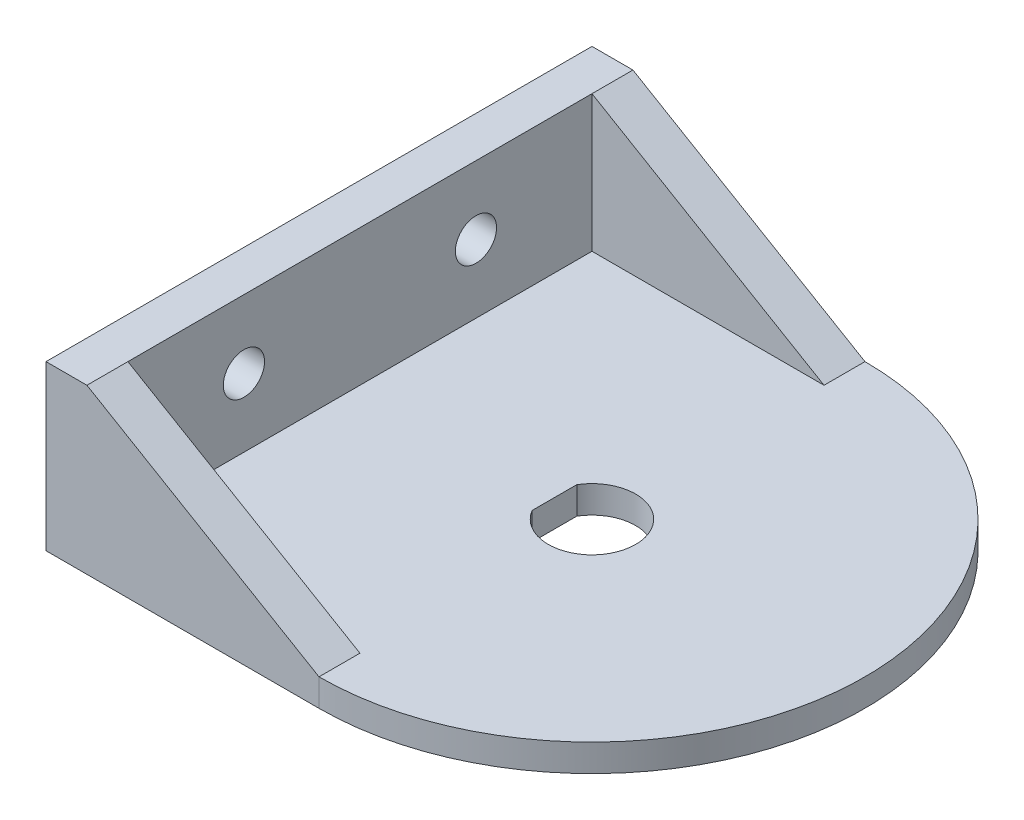
ISO-10303-21;
HEADER;
FILE_DESCRIPTION(('STEP AP214'),'2;1');
FILE_NAME('part.step','',(''),(''),'','','');
FILE_SCHEMA(('AUTOMOTIVE_DESIGN { 1 0 10303 214 1 1 1 1 }'));
ENDSEC;
DATA;
#1=APPLICATION_CONTEXT('core data for automotive mechanical design processes');
#2=APPLICATION_PROTOCOL_DEFINITION('international standard','automotive_design',2000,#1);
#3=PRODUCT_CONTEXT('',#1,'mechanical');
#4=PRODUCT('Part','Part','',(#3));
#5=PRODUCT_RELATED_PRODUCT_CATEGORY('part','',(#4));
#6=PRODUCT_DEFINITION_FORMATION('','',#4);
#7=PRODUCT_DEFINITION_CONTEXT('part definition',#1,'design');
#8=PRODUCT_DEFINITION('design','',#6,#7);
#9=PRODUCT_DEFINITION_SHAPE('','',#8);
#10=(LENGTH_UNIT() NAMED_UNIT(*) SI_UNIT(.MILLI.,.METRE.));
#11=(NAMED_UNIT(*) PLANE_ANGLE_UNIT() SI_UNIT($,.RADIAN.));
#12=(NAMED_UNIT(*) SI_UNIT($,.STERADIAN.) SOLID_ANGLE_UNIT());
#13=UNCERTAINTY_MEASURE_WITH_UNIT(LENGTH_MEASURE(1.E-05),#10,'distance_accuracy_value','');
#14=(GEOMETRIC_REPRESENTATION_CONTEXT(3) GLOBAL_UNCERTAINTY_ASSIGNED_CONTEXT((#13)) GLOBAL_UNIT_ASSIGNED_CONTEXT((#10,
#11,#12)) REPRESENTATION_CONTEXT('',''));
#15=CARTESIAN_POINT('',(0.,0.,0.));
#16=DIRECTION('',(0.,0.,1.));
#17=DIRECTION('',(1.,0.,0.));
#18=AXIS2_PLACEMENT_3D('',#15,#16,#17);
#19=CARTESIAN_POINT('',(0.,2.,0.));
#20=DIRECTION('',(0.,-1.,0.));
#21=DIRECTION('',(0.,0.,-1.));
#22=AXIS2_PLACEMENT_3D('',#19,#20,#21);
#23=CYLINDRICAL_SURFACE('',#22,3.2);
#24=CARTESIAN_POINT('',(0.,2.,0.));
#25=DIRECTION('',(0.,1.,0.));
#26=DIRECTION('',(0.,0.,1.));
#27=AXIS2_PLACEMENT_3D('',#24,#25,#26);
#28=CIRCLE('',#27,3.2);
#29=CARTESIAN_POINT('',(-2.75,2.,1.63630681719536));
#30=VERTEX_POINT('',#29);
#31=CARTESIAN_POINT('',(-2.75,2.,-1.63630681719536));
#32=VERTEX_POINT('',#31);
#33=EDGE_CURVE('E135',#30,#32,#28,.T.);
#34=ORIENTED_EDGE('',*,*,#33,.T.);
#35=DIRECTION('',(0.,1.,0.));
#36=VECTOR('',#35,1.);
#37=CARTESIAN_POINT('',(-2.75,-3.30340733183179,-1.63630681719536));
#38=LINE('',#37,#36);
#39=CARTESIAN_POINT('',(-2.75,0.,-1.63630681719536));
#40=VERTEX_POINT('',#39);
#41=EDGE_CURVE('E121',#40,#32,#38,.T.);
#42=ORIENTED_EDGE('',*,*,#41,.F.);
#43=CARTESIAN_POINT('',(0.,0.,0.));
#44=DIRECTION('',(0.,1.,0.));
#45=DIRECTION('',(0.,0.,1.));
#46=AXIS2_PLACEMENT_3D('',#43,#44,#45);
#47=CIRCLE('',#46,3.2);
#48=CARTESIAN_POINT('',(-2.75,0.,1.63630681719536));
#49=VERTEX_POINT('',#48);
#50=EDGE_CURVE('E148',#49,#40,#47,.T.);
#51=ORIENTED_EDGE('',*,*,#50,.F.);
#52=DIRECTION('',(0.,1.,0.));
#53=VECTOR('',#52,1.);
#54=CARTESIAN_POINT('',(-2.75,-3.30340733183179,1.63630681719536));
#55=LINE('',#54,#53);
#56=EDGE_CURVE('E61',#49,#30,#55,.T.);
#57=ORIENTED_EDGE('',*,*,#56,.T.);
#58=EDGE_LOOP('',(#34,#42,#51,#57));
#59=FACE_BOUND('',#58,.T.);
#60=ADVANCED_FACE('F45',(#59),#23,.F.);
#61=CARTESIAN_POINT('',(-17.,12.,0.));
#62=DIRECTION('',(1.,0.,0.));
#63=DIRECTION('',(0.,0.,-1.));
#64=AXIS2_PLACEMENT_3D('',#61,#62,#63);
#65=PLANE('',#64);
#66=CARTESIAN_POINT('',(-17.,7.,8.5));
#67=DIRECTION('',(1.,0.,0.));
#68=DIRECTION('',(0.,0.,-1.));
#69=AXIS2_PLACEMENT_3D('',#66,#67,#68);
#70=CIRCLE('',#69,1.51);
#71=CARTESIAN_POINT('',(-17.,7.,6.99));
#72=VERTEX_POINT('',#71);
#73=EDGE_CURVE('E518',#72,#72,#70,.T.);
#74=ORIENTED_EDGE('',*,*,#73,.F.);
#75=EDGE_LOOP('',(#74));
#76=FACE_BOUND('',#75,.T.);
#77=CARTESIAN_POINT('',(-17.,7.,-8.5));
#78=DIRECTION('',(1.,0.,0.));
#79=DIRECTION('',(0.,0.,-1.));
#80=AXIS2_PLACEMENT_3D('',#77,#78,#79);
#81=CIRCLE('',#80,1.51);
#82=CARTESIAN_POINT('',(-17.,7.,-10.01));
#83=VERTEX_POINT('',#82);
#84=EDGE_CURVE('E526',#83,#83,#81,.T.);
#85=ORIENTED_EDGE('',*,*,#84,.F.);
#86=EDGE_LOOP('',(#85));
#87=FACE_BOUND('',#86,.T.);
#88=DIRECTION('',(0.,1.,0.));
#89=VECTOR('',#88,1.);
#90=CARTESIAN_POINT('',(-17.,2.,-17.));
#91=LINE('',#90,#89);
#92=CARTESIAN_POINT('',(-17.,2.,-17.));
#93=VERTEX_POINT('',#92);
#94=CARTESIAN_POINT('',(-17.,12.,-17.));
#95=VERTEX_POINT('',#94);
#96=EDGE_CURVE('E240',#93,#95,#91,.T.);
#97=ORIENTED_EDGE('',*,*,#96,.T.);
#98=DIRECTION('',(0.,0.,1.));
#99=VECTOR('',#98,1.);
#100=CARTESIAN_POINT('',(-17.,12.,0.));
#101=LINE('',#100,#99);
#102=CARTESIAN_POINT('',(-17.,12.,17.));
#103=VERTEX_POINT('',#102);
#104=EDGE_CURVE('E226',#95,#103,#101,.T.);
#105=ORIENTED_EDGE('',*,*,#104,.T.);
#106=DIRECTION('',(0.,-1.,0.));
#107=VECTOR('',#106,1.);
#108=CARTESIAN_POINT('',(-17.,2.,17.));
#109=LINE('',#108,#107);
#110=CARTESIAN_POINT('',(-17.,2.,17.));
#111=VERTEX_POINT('',#110);
#112=EDGE_CURVE('E205',#103,#111,#109,.T.);
#113=ORIENTED_EDGE('',*,*,#112,.T.);
#114=DIRECTION('',(0.,0.,-1.));
#115=VECTOR('',#114,1.);
#116=CARTESIAN_POINT('',(-17.,2.,0.));
#117=LINE('',#116,#115);
#118=EDGE_CURVE('E157',#111,#93,#117,.T.);
#119=ORIENTED_EDGE('',*,*,#118,.T.);
#120=EDGE_LOOP('',(#97,#105,#113,#119));
#121=FACE_BOUND('',#120,.T.);
#122=ADVANCED_FACE('F239',(#76,#87,#121),#65,.T.);
#123=CARTESIAN_POINT('',(0.,2.,0.));
#124=DIRECTION('',(0.,-1.,0.));
#125=DIRECTION('',(0.,0.,-1.));
#126=AXIS2_PLACEMENT_3D('',#123,#124,#125);
#127=CYLINDRICAL_SURFACE('',#126,20.);
#128=CARTESIAN_POINT('',(0.,0.,0.));
#129=DIRECTION('',(0.,1.,0.));
#130=DIRECTION('',(0.,0.,1.));
#131=AXIS2_PLACEMENT_3D('',#128,#129,#130);
#132=CIRCLE('',#131,20.);
#133=CARTESIAN_POINT('',(0.,0.,20.));
#134=VERTEX_POINT('',#133);
#135=CARTESIAN_POINT('',(0.,0.,-20.));
#136=VERTEX_POINT('',#135);
#137=EDGE_CURVE('E152',#134,#136,#132,.T.);
#138=ORIENTED_EDGE('',*,*,#137,.T.);
#139=DIRECTION('',(0.,-1.,0.));
#140=VECTOR('',#139,1.);
#141=CARTESIAN_POINT('',(0.,2.,-20.));
#142=LINE('',#141,#140);
#143=CARTESIAN_POINT('',(0.,2.,-20.));
#144=VERTEX_POINT('',#143);
#145=EDGE_CURVE('E11',#144,#136,#142,.T.);
#146=ORIENTED_EDGE('',*,*,#145,.F.);
#147=CARTESIAN_POINT('',(0.,2.,0.));
#148=DIRECTION('',(0.,1.,0.));
#149=DIRECTION('',(0.,0.,1.));
#150=AXIS2_PLACEMENT_3D('',#147,#148,#149);
#151=CIRCLE('',#150,20.);
#152=CARTESIAN_POINT('',(0.,2.,20.));
#153=VERTEX_POINT('',#152);
#154=EDGE_CURVE('E141',#153,#144,#151,.T.);
#155=ORIENTED_EDGE('',*,*,#154,.F.);
#156=DIRECTION('',(0.,-1.,0.));
#157=VECTOR('',#156,1.);
#158=CARTESIAN_POINT('',(0.,2.,20.));
#159=LINE('',#158,#157);
#160=EDGE_CURVE('E140',#153,#134,#159,.T.);
#161=ORIENTED_EDGE('',*,*,#160,.T.);
#162=EDGE_LOOP('',(#138,#146,#155,#161));
#163=FACE_BOUND('',#162,.T.);
#164=ADVANCED_FACE('F47',(#163),#127,.T.);
#165=CARTESIAN_POINT('',(0.,2.,-20.));
#166=DIRECTION('',(0.,0.,1.));
#167=DIRECTION('',(1.,0.,0.));
#168=AXIS2_PLACEMENT_3D('',#165,#166,#167);
#169=PLANE('',#168);
#170=DIRECTION('',(-1.,0.,0.));
#171=VECTOR('',#170,1.);
#172=CARTESIAN_POINT('',(0.,0.,-20.));
#173=LINE('',#172,#171);
#174=CARTESIAN_POINT('',(-20.,0.,-20.));
#175=VERTEX_POINT('',#174);
#176=EDGE_CURVE('E156',#136,#175,#173,.T.);
#177=ORIENTED_EDGE('',*,*,#176,.T.);
#178=DIRECTION('',(0.,-1.,0.));
#179=VECTOR('',#178,1.);
#180=CARTESIAN_POINT('',(-20.,2.,-20.));
#181=LINE('',#180,#179);
#182=CARTESIAN_POINT('',(-20.,12.,-20.));
#183=VERTEX_POINT('',#182);
#184=EDGE_CURVE('E54',#183,#175,#181,.T.);
#185=ORIENTED_EDGE('',*,*,#184,.F.);
#186=DIRECTION('',(-1.,0.,0.));
#187=VECTOR('',#186,1.);
#188=CARTESIAN_POINT('',(0.,12.,-20.));
#189=LINE('',#188,#187);
#190=CARTESIAN_POINT('',(-17.,12.,-20.));
#191=VERTEX_POINT('',#190);
#192=EDGE_CURVE('E231',#191,#183,#189,.T.);
#193=ORIENTED_EDGE('',*,*,#192,.F.);
#194=DIRECTION('',(0.86193421515777,-0.507020126563394,0.));
#195=VECTOR('',#194,1.);
#196=CARTESIAN_POINT('',(-17.,12.,-20.));
#197=LINE('',#196,#195);
#198=EDGE_CURVE('E249',#191,#144,#197,.T.);
#199=ORIENTED_EDGE('',*,*,#198,.T.);
#200=ORIENTED_EDGE('',*,*,#145,.T.);
#201=EDGE_LOOP('',(#177,#185,#193,#199,#200));
#202=FACE_BOUND('',#201,.T.);
#203=ADVANCED_FACE('F287',(#202),#169,.F.);
#204=CARTESIAN_POINT('',(-20.,2.,0.));
#205=DIRECTION('',(1.,0.,0.));
#206=DIRECTION('',(0.,0.,-1.));
#207=AXIS2_PLACEMENT_3D('',#204,#205,#206);
#208=PLANE('',#207);
#209=CARTESIAN_POINT('',(-20.,7.,8.5));
#210=DIRECTION('',(1.,0.,0.));
#211=DIRECTION('',(0.,0.,-1.));
#212=AXIS2_PLACEMENT_3D('',#209,#210,#211);
#213=CIRCLE('',#212,1.51);
#214=CARTESIAN_POINT('',(-20.,7.,6.99));
#215=VERTEX_POINT('',#214);
#216=EDGE_CURVE('E137',#215,#215,#213,.T.);
#217=ORIENTED_EDGE('',*,*,#216,.T.);
#218=EDGE_LOOP('',(#217));
#219=FACE_BOUND('',#218,.T.);
#220=CARTESIAN_POINT('',(-20.,7.,-8.5));
#221=DIRECTION('',(1.,0.,0.));
#222=DIRECTION('',(0.,0.,-1.));
#223=AXIS2_PLACEMENT_3D('',#220,#221,#222);
#224=CIRCLE('',#223,1.51);
#225=CARTESIAN_POINT('',(-20.,7.,-10.01));
#226=VERTEX_POINT('',#225);
#227=EDGE_CURVE('E520',#226,#226,#224,.T.);
#228=ORIENTED_EDGE('',*,*,#227,.T.);
#229=EDGE_LOOP('',(#228));
#230=FACE_BOUND('',#229,.T.);
#231=DIRECTION('',(0.,0.,1.));
#232=VECTOR('',#231,1.);
#233=CARTESIAN_POINT('',(-20.,0.,0.));
#234=LINE('',#233,#232);
#235=CARTESIAN_POINT('',(-20.,0.,20.));
#236=VERTEX_POINT('',#235);
#237=EDGE_CURVE('E160',#175,#236,#234,.T.);
#238=ORIENTED_EDGE('',*,*,#237,.T.);
#239=DIRECTION('',(0.,-1.,0.));
#240=VECTOR('',#239,1.);
#241=CARTESIAN_POINT('',(-20.,2.,20.));
#242=LINE('',#241,#240);
#243=CARTESIAN_POINT('',(-20.,12.,20.));
#244=VERTEX_POINT('',#243);
#245=EDGE_CURVE('E146',#244,#236,#242,.T.);
#246=ORIENTED_EDGE('',*,*,#245,.F.);
#247=DIRECTION('',(0.,0.,1.));
#248=VECTOR('',#247,1.);
#249=CARTESIAN_POINT('',(-20.,12.,0.));
#250=LINE('',#249,#248);
#251=EDGE_CURVE('E177',#183,#244,#250,.T.);
#252=ORIENTED_EDGE('',*,*,#251,.F.);
#253=ORIENTED_EDGE('',*,*,#184,.T.);
#254=EDGE_LOOP('',(#238,#246,#252,#253));
#255=FACE_BOUND('',#254,.T.);
#256=ADVANCED_FACE('F175',(#219,#230,#255),#208,.F.);
#257=CARTESIAN_POINT('',(0.,2.,20.));
#258=DIRECTION('',(0.,0.,-1.));
#259=DIRECTION('',(-1.,0.,0.));
#260=AXIS2_PLACEMENT_3D('',#257,#258,#259);
#261=PLANE('',#260);
#262=ORIENTED_EDGE('',*,*,#160,.F.);
#263=DIRECTION('',(-0.86193421515777,0.507020126563394,0.));
#264=VECTOR('',#263,1.);
#265=CARTESIAN_POINT('',(-17.,12.,20.));
#266=LINE('',#265,#264);
#267=CARTESIAN_POINT('',(-17.,12.,20.));
#268=VERTEX_POINT('',#267);
#269=EDGE_CURVE('E197',#153,#268,#266,.T.);
#270=ORIENTED_EDGE('',*,*,#269,.T.);
#271=DIRECTION('',(1.,0.,0.));
#272=VECTOR('',#271,1.);
#273=CARTESIAN_POINT('',(0.,12.,20.));
#274=LINE('',#273,#272);
#275=EDGE_CURVE('E223',#244,#268,#274,.T.);
#276=ORIENTED_EDGE('',*,*,#275,.F.);
#277=ORIENTED_EDGE('',*,*,#245,.T.);
#278=DIRECTION('',(1.,0.,0.));
#279=VECTOR('',#278,1.);
#280=CARTESIAN_POINT('',(0.,0.,20.));
#281=LINE('',#280,#279);
#282=EDGE_CURVE('E163',#236,#134,#281,.T.);
#283=ORIENTED_EDGE('',*,*,#282,.T.);
#284=EDGE_LOOP('',(#262,#270,#276,#277,#283));
#285=FACE_BOUND('',#284,.T.);
#286=ADVANCED_FACE('F187',(#285),#261,.F.);
#287=CARTESIAN_POINT('',(0.,2.,0.));
#288=DIRECTION('',(0.,1.,0.));
#289=DIRECTION('',(0.,0.,1.));
#290=AXIS2_PLACEMENT_3D('',#287,#288,#289);
#291=PLANE('',#290);
#292=DIRECTION('',(0.,0.,-1.));
#293=VECTOR('',#292,1.);
#294=CARTESIAN_POINT('',(0.,2.,-17.));
#295=LINE('',#294,#293);
#296=CARTESIAN_POINT('',(0.,2.,-17.));
#297=VERTEX_POINT('',#296);
#298=EDGE_CURVE('E69',#297,#144,#295,.T.);
#299=ORIENTED_EDGE('',*,*,#298,.F.);
#300=DIRECTION('',(-1.,0.,0.));
#301=VECTOR('',#300,1.);
#302=CARTESIAN_POINT('',(0.,2.,-17.));
#303=LINE('',#302,#301);
#304=EDGE_CURVE('E211',#297,#93,#303,.T.);
#305=ORIENTED_EDGE('',*,*,#304,.T.);
#306=ORIENTED_EDGE('',*,*,#118,.F.);
#307=DIRECTION('',(1.,0.,0.));
#308=VECTOR('',#307,1.);
#309=CARTESIAN_POINT('',(0.,2.,17.));
#310=LINE('',#309,#308);
#311=CARTESIAN_POINT('',(0.,2.,17.));
#312=VERTEX_POINT('',#311);
#313=EDGE_CURVE('E209',#111,#312,#310,.T.);
#314=ORIENTED_EDGE('',*,*,#313,.T.);
#315=DIRECTION('',(0.,0.,1.));
#316=VECTOR('',#315,1.);
#317=CARTESIAN_POINT('',(0.,2.,17.));
#318=LINE('',#317,#316);
#319=EDGE_CURVE('E200',#312,#153,#318,.T.);
#320=ORIENTED_EDGE('',*,*,#319,.T.);
#321=ORIENTED_EDGE('',*,*,#154,.T.);
#322=EDGE_LOOP('',(#299,#305,#306,#314,#320,#321));
#323=FACE_BOUND('',#322,.T.);
#324=ORIENTED_EDGE('',*,*,#33,.F.);
#325=DIRECTION('',(0.,0.,1.));
#326=VECTOR('',#325,1.);
#327=CARTESIAN_POINT('',(-2.75,2.,0.));
#328=LINE('',#327,#326);
#329=EDGE_CURVE('E124',#32,#30,#328,.T.);
#330=ORIENTED_EDGE('',*,*,#329,.F.);
#331=EDGE_LOOP('',(#324,#330));
#332=FACE_BOUND('',#331,.T.);
#333=ADVANCED_FACE('F134',(#323,#332),#291,.T.);
#334=CARTESIAN_POINT('',(0.,0.,0.));
#335=DIRECTION('',(0.,1.,0.));
#336=DIRECTION('',(0.,0.,1.));
#337=AXIS2_PLACEMENT_3D('',#334,#335,#336);
#338=PLANE('',#337);
#339=ORIENTED_EDGE('',*,*,#137,.F.);
#340=ORIENTED_EDGE('',*,*,#282,.F.);
#341=ORIENTED_EDGE('',*,*,#237,.F.);
#342=ORIENTED_EDGE('',*,*,#176,.F.);
#343=EDGE_LOOP('',(#339,#340,#341,#342));
#344=FACE_BOUND('',#343,.T.);
#345=ORIENTED_EDGE('',*,*,#50,.T.);
#346=DIRECTION('',(0.,0.,-1.));
#347=VECTOR('',#346,1.);
#348=CARTESIAN_POINT('',(-2.75,0.,0.));
#349=LINE('',#348,#347);
#350=EDGE_CURVE('E125',#49,#40,#349,.T.);
#351=ORIENTED_EDGE('',*,*,#350,.F.);
#352=EDGE_LOOP('',(#345,#351));
#353=FACE_BOUND('',#352,.T.);
#354=ADVANCED_FACE('F183',(#344,#353),#338,.F.);
#355=CARTESIAN_POINT('',(0.,12.,0.));
#356=DIRECTION('',(0.,1.,0.));
#357=DIRECTION('',(0.,0.,1.));
#358=AXIS2_PLACEMENT_3D('',#355,#356,#357);
#359=PLANE('',#358);
#360=ORIENTED_EDGE('',*,*,#251,.T.);
#361=ORIENTED_EDGE('',*,*,#275,.T.);
#362=DIRECTION('',(0.,0.,1.));
#363=VECTOR('',#362,1.);
#364=CARTESIAN_POINT('',(-17.,12.,17.));
#365=LINE('',#364,#363);
#366=EDGE_CURVE('E203',#103,#268,#365,.T.);
#367=ORIENTED_EDGE('',*,*,#366,.F.);
#368=ORIENTED_EDGE('',*,*,#104,.F.);
#369=EDGE_CURVE('E227',#191,#95,#101,.T.);
#370=ORIENTED_EDGE('',*,*,#369,.F.);
#371=ORIENTED_EDGE('',*,*,#192,.T.);
#372=EDGE_LOOP('',(#360,#361,#367,#368,#370,#371));
#373=FACE_BOUND('',#372,.T.);
#374=ADVANCED_FACE('F272',(#373),#359,.T.);
#375=CARTESIAN_POINT('',(-17.,12.,17.));
#376=DIRECTION('',(0.507020126563394,0.861934215157769,0.));
#377=DIRECTION('',(-0.86193421515777,0.507020126563394,0.));
#378=AXIS2_PLACEMENT_3D('',#375,#376,#377);
#379=PLANE('',#378);
#380=ORIENTED_EDGE('',*,*,#269,.F.);
#381=ORIENTED_EDGE('',*,*,#319,.F.);
#382=DIRECTION('',(-0.86193421515777,0.507020126563394,0.));
#383=VECTOR('',#382,1.);
#384=CARTESIAN_POINT('',(-17.,12.,17.));
#385=LINE('',#384,#383);
#386=EDGE_CURVE('E215',#312,#103,#385,.T.);
#387=ORIENTED_EDGE('',*,*,#386,.T.);
#388=ORIENTED_EDGE('',*,*,#366,.T.);
#389=EDGE_LOOP('',(#380,#381,#387,#388));
#390=FACE_BOUND('',#389,.T.);
#391=ADVANCED_FACE('F198',(#390),#379,.T.);
#392=CARTESIAN_POINT('',(0.,0.,17.));
#393=DIRECTION('',(0.,0.,1.));
#394=DIRECTION('',(1.,0.,0.));
#395=AXIS2_PLACEMENT_3D('',#392,#393,#394);
#396=PLANE('',#395);
#397=ORIENTED_EDGE('',*,*,#112,.F.);
#398=ORIENTED_EDGE('',*,*,#386,.F.);
#399=ORIENTED_EDGE('',*,*,#313,.F.);
#400=EDGE_LOOP('',(#397,#398,#399));
#401=FACE_BOUND('',#400,.T.);
#402=ADVANCED_FACE('F262',(#401),#396,.F.);
#403=CARTESIAN_POINT('',(-17.,12.,-17.));
#404=DIRECTION('',(0.507020126563394,0.86193421515777,0.));
#405=DIRECTION('',(-0.86193421515777,0.507020126563394,0.));
#406=AXIS2_PLACEMENT_3D('',#403,#404,#405);
#407=PLANE('',#406);
#408=ORIENTED_EDGE('',*,*,#198,.F.);
#409=ORIENTED_EDGE('',*,*,#369,.T.);
#410=DIRECTION('',(0.86193421515777,-0.507020126563394,0.));
#411=VECTOR('',#410,1.);
#412=CARTESIAN_POINT('',(-17.,12.,-17.));
#413=LINE('',#412,#411);
#414=EDGE_CURVE('E247',#95,#297,#413,.T.);
#415=ORIENTED_EDGE('',*,*,#414,.T.);
#416=ORIENTED_EDGE('',*,*,#298,.T.);
#417=EDGE_LOOP('',(#408,#409,#415,#416));
#418=FACE_BOUND('',#417,.T.);
#419=ADVANCED_FACE('F264',(#418),#407,.T.);
#420=CARTESIAN_POINT('',(0.,0.,-17.));
#421=DIRECTION('',(0.,0.,1.));
#422=DIRECTION('',(1.,0.,0.));
#423=AXIS2_PLACEMENT_3D('',#420,#421,#422);
#424=PLANE('',#423);
#425=ORIENTED_EDGE('',*,*,#96,.F.);
#426=ORIENTED_EDGE('',*,*,#304,.F.);
#427=ORIENTED_EDGE('',*,*,#414,.F.);
#428=EDGE_LOOP('',(#425,#426,#427));
#429=FACE_BOUND('',#428,.T.);
#430=ADVANCED_FACE('F246',(#429),#424,.T.);
#431=CARTESIAN_POINT('',(-2.75,-3.30340733183179,0.));
#432=DIRECTION('',(-1.,0.,0.));
#433=DIRECTION('',(0.,0.,1.));
#434=AXIS2_PLACEMENT_3D('',#431,#432,#433);
#435=PLANE('',#434);
#436=ORIENTED_EDGE('',*,*,#56,.F.);
#437=ORIENTED_EDGE('',*,*,#350,.T.);
#438=ORIENTED_EDGE('',*,*,#41,.T.);
#439=ORIENTED_EDGE('',*,*,#329,.T.);
#440=EDGE_LOOP('',(#436,#437,#438,#439));
#441=FACE_BOUND('',#440,.T.);
#442=ADVANCED_FACE('F123',(#441),#435,.F.);
#443=CARTESIAN_POINT('',(-20.,7.,-8.5));
#444=DIRECTION('',(1.,0.,0.));
#445=DIRECTION('',(0.,0.,-1.));
#446=AXIS2_PLACEMENT_3D('',#443,#444,#445);
#447=CYLINDRICAL_SURFACE('',#446,1.51);
#448=ORIENTED_EDGE('',*,*,#227,.F.);
#449=EDGE_LOOP('',(#448));
#450=FACE_BOUND('',#449,.T.);
#451=ORIENTED_EDGE('',*,*,#84,.T.);
#452=EDGE_LOOP('',(#451));
#453=FACE_BOUND('',#452,.T.);
#454=ADVANCED_FACE('F322',(#450,#453),#447,.F.);
#455=CARTESIAN_POINT('',(-20.,7.,8.5));
#456=DIRECTION('',(1.,0.,0.));
#457=DIRECTION('',(0.,0.,-1.));
#458=AXIS2_PLACEMENT_3D('',#455,#456,#457);
#459=CYLINDRICAL_SURFACE('',#458,1.51);
#460=ORIENTED_EDGE('',*,*,#216,.F.);
#461=EDGE_LOOP('',(#460));
#462=FACE_BOUND('',#461,.T.);
#463=ORIENTED_EDGE('',*,*,#73,.T.);
#464=EDGE_LOOP('',(#463));
#465=FACE_BOUND('',#464,.T.);
#466=ADVANCED_FACE('F348',(#462,#465),#459,.F.);
#467=CLOSED_SHELL('',(#60,#122,#164,#203,#256,#286,#333,#354,#374,#391,#402,#419,#430,#442,#454,#466));
#468=MANIFOLD_SOLID_BREP('B2',#467);
#469=ADVANCED_BREP_SHAPE_REPRESENTATION('',(#18,#468),#14);
#470=SHAPE_DEFINITION_REPRESENTATION(#9,#469);
ENDSEC;
END-ISO-10303-21;
